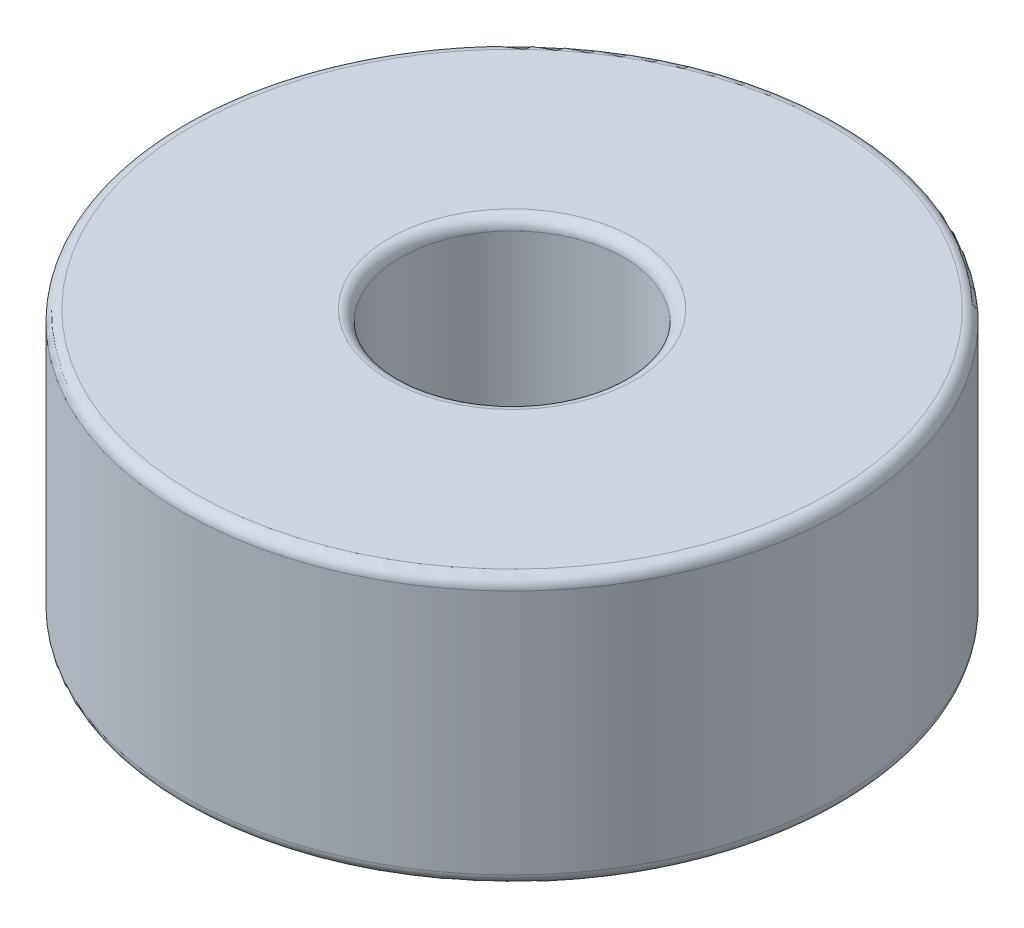
ISO-10303-21;
HEADER;
FILE_DESCRIPTION(('STEP AP214'),'2;1');
FILE_NAME('part.step','',(''),(''),'','','');
FILE_SCHEMA(('AUTOMOTIVE_DESIGN { 1 0 10303 214 1 1 1 1 }'));
ENDSEC;
DATA;
#1=APPLICATION_CONTEXT('core data for automotive mechanical design processes');
#2=APPLICATION_PROTOCOL_DEFINITION('international standard','automotive_design',2000,#1);
#3=PRODUCT_CONTEXT('',#1,'mechanical');
#4=PRODUCT('Part','Part','',(#3));
#5=PRODUCT_RELATED_PRODUCT_CATEGORY('part','',(#4));
#6=PRODUCT_DEFINITION_FORMATION('','',#4);
#7=PRODUCT_DEFINITION_CONTEXT('part definition',#1,'design');
#8=PRODUCT_DEFINITION('design','',#6,#7);
#9=PRODUCT_DEFINITION_SHAPE('','',#8);
#10=(LENGTH_UNIT() NAMED_UNIT(*) SI_UNIT(.MILLI.,.METRE.));
#11=(NAMED_UNIT(*) PLANE_ANGLE_UNIT() SI_UNIT($,.RADIAN.));
#12=(NAMED_UNIT(*) SI_UNIT($,.STERADIAN.) SOLID_ANGLE_UNIT());
#13=UNCERTAINTY_MEASURE_WITH_UNIT(LENGTH_MEASURE(1.E-05),#10,'distance_accuracy_value','');
#14=(GEOMETRIC_REPRESENTATION_CONTEXT(3) GLOBAL_UNCERTAINTY_ASSIGNED_CONTEXT((#13)) GLOBAL_UNIT_ASSIGNED_CONTEXT((#10,
#11,#12)) REPRESENTATION_CONTEXT('',''));
#15=CARTESIAN_POINT('',(0.,0.,0.));
#16=DIRECTION('',(0.,0.,1.));
#17=DIRECTION('',(1.,0.,0.));
#18=AXIS2_PLACEMENT_3D('',#15,#16,#17);
#19=CARTESIAN_POINT('',(0.,2.4,0.));
#20=DIRECTION('',(0.,-1.,0.));
#21=DIRECTION('',(0.,0.,-1.));
#22=AXIS2_PLACEMENT_3D('',#19,#20,#21);
#23=CYLINDRICAL_SURFACE('',#22,2.95);
#24=CARTESIAN_POINT('',(0.,0.0999999999999998,0.));
#25=DIRECTION('',(0.,1.,0.));
#26=DIRECTION('',(0.,0.,1.));
#27=AXIS2_PLACEMENT_3D('',#24,#25,#26);
#28=CIRCLE('',#27,2.95);
#29=CARTESIAN_POINT('',(0.,0.0999999999999998,2.95));
#30=VERTEX_POINT('',#29);
#31=EDGE_CURVE('E10',#30,#30,#28,.T.);
#32=ORIENTED_EDGE('',*,*,#31,.T.);
#33=EDGE_LOOP('',(#32));
#34=FACE_BOUND('',#33,.T.);
#35=CARTESIAN_POINT('',(0.,2.3,0.));
#36=DIRECTION('',(0.,1.,0.));
#37=DIRECTION('',(0.,0.,1.));
#38=AXIS2_PLACEMENT_3D('',#35,#36,#37);
#39=CIRCLE('',#38,2.95);
#40=CARTESIAN_POINT('',(0.,2.3,2.95));
#41=VERTEX_POINT('',#40);
#42=EDGE_CURVE('E37',#41,#41,#39,.F.);
#43=ORIENTED_EDGE('',*,*,#42,.T.);
#44=EDGE_LOOP('',(#43));
#45=FACE_BOUND('',#44,.T.);
#46=ADVANCED_FACE('F30',(#34,#45),#23,.T.);
#47=CARTESIAN_POINT('',(0.,2.4,0.));
#48=DIRECTION('',(0.,1.,0.));
#49=DIRECTION('',(0.,0.,1.));
#50=AXIS2_PLACEMENT_3D('',#47,#48,#49);
#51=PLANE('',#50);
#52=CARTESIAN_POINT('',(0.,2.4,0.));
#53=DIRECTION('',(0.,1.,0.));
#54=DIRECTION('',(0.,0.,1.));
#55=AXIS2_PLACEMENT_3D('',#52,#53,#54);
#56=CIRCLE('',#55,1.1);
#57=CARTESIAN_POINT('',(0.,2.4,1.1));
#58=VERTEX_POINT('',#57);
#59=EDGE_CURVE('E50',#58,#58,#56,.F.);
#60=ORIENTED_EDGE('',*,*,#59,.T.);
#61=EDGE_LOOP('',(#60));
#62=FACE_BOUND('',#61,.T.);
#63=CARTESIAN_POINT('',(0.,2.4,0.));
#64=DIRECTION('',(0.,1.,0.));
#65=DIRECTION('',(0.,0.,1.));
#66=AXIS2_PLACEMENT_3D('',#63,#64,#65);
#67=CIRCLE('',#66,2.85);
#68=CARTESIAN_POINT('',(0.,2.4,2.85));
#69=VERTEX_POINT('',#68);
#70=EDGE_CURVE('E53',#69,#69,#67,.T.);
#71=ORIENTED_EDGE('',*,*,#70,.T.);
#72=EDGE_LOOP('',(#71));
#73=FACE_BOUND('',#72,.T.);
#74=ADVANCED_FACE('F76',(#62,#73),#51,.T.);
#75=CARTESIAN_POINT('',(0.,0.,0.));
#76=DIRECTION('',(0.,1.,0.));
#77=DIRECTION('',(0.,0.,1.));
#78=AXIS2_PLACEMENT_3D('',#75,#76,#77);
#79=PLANE('',#78);
#80=CARTESIAN_POINT('',(0.,0.,0.));
#81=DIRECTION('',(0.,1.,0.));
#82=DIRECTION('',(0.,0.,1.));
#83=AXIS2_PLACEMENT_3D('',#80,#81,#82);
#84=CIRCLE('',#83,1.1);
#85=CARTESIAN_POINT('',(0.,0.,1.1));
#86=VERTEX_POINT('',#85);
#87=EDGE_CURVE('E41',#86,#86,#84,.T.);
#88=ORIENTED_EDGE('',*,*,#87,.T.);
#89=EDGE_LOOP('',(#88));
#90=FACE_BOUND('',#89,.T.);
#91=CARTESIAN_POINT('',(0.,0.,0.));
#92=DIRECTION('',(0.,1.,0.));
#93=DIRECTION('',(0.,0.,1.));
#94=AXIS2_PLACEMENT_3D('',#91,#92,#93);
#95=CIRCLE('',#94,2.85);
#96=CARTESIAN_POINT('',(0.,0.,2.85));
#97=VERTEX_POINT('',#96);
#98=EDGE_CURVE('E45',#97,#97,#95,.F.);
#99=ORIENTED_EDGE('',*,*,#98,.T.);
#100=EDGE_LOOP('',(#99));
#101=FACE_BOUND('',#100,.T.);
#102=ADVANCED_FACE('F73',(#90,#101),#79,.F.);
#103=CARTESIAN_POINT('',(0.,0.,0.));
#104=DIRECTION('',(0.,1.,0.));
#105=DIRECTION('',(0.,0.,1.));
#106=AXIS2_PLACEMENT_3D('',#103,#104,#105);
#107=CYLINDRICAL_SURFACE('',#106,1.);
#108=CARTESIAN_POINT('',(0.,2.3,0.));
#109=DIRECTION('',(0.,1.,0.));
#110=DIRECTION('',(0.,0.,1.));
#111=AXIS2_PLACEMENT_3D('',#108,#109,#110);
#112=CIRCLE('',#111,1.);
#113=CARTESIAN_POINT('',(0.,2.3,1.));
#114=VERTEX_POINT('',#113);
#115=EDGE_CURVE('E56',#114,#114,#112,.T.);
#116=ORIENTED_EDGE('',*,*,#115,.T.);
#117=EDGE_LOOP('',(#116));
#118=FACE_BOUND('',#117,.T.);
#119=CARTESIAN_POINT('',(0.,0.1,0.));
#120=DIRECTION('',(0.,1.,0.));
#121=DIRECTION('',(0.,0.,1.));
#122=AXIS2_PLACEMENT_3D('',#119,#120,#121);
#123=CIRCLE('',#122,1.);
#124=CARTESIAN_POINT('',(0.,0.1,1.));
#125=VERTEX_POINT('',#124);
#126=EDGE_CURVE('E59',#125,#125,#123,.F.);
#127=ORIENTED_EDGE('',*,*,#126,.T.);
#128=EDGE_LOOP('',(#127));
#129=FACE_BOUND('',#128,.T.);
#130=ADVANCED_FACE('F63',(#118,#129),#107,.F.);
#131=CARTESIAN_POINT('',(0.,2.3,0.));
#132=DIRECTION('',(0.,1.,0.));
#133=DIRECTION('',(0.,0.,1.));
#134=AXIS2_PLACEMENT_3D('',#131,#132,#133);
#135=TOROIDAL_SURFACE('',#134,1.1,0.1);
#136=ORIENTED_EDGE('',*,*,#59,.F.);
#137=EDGE_LOOP('',(#136));
#138=FACE_BOUND('',#137,.T.);
#139=ORIENTED_EDGE('',*,*,#115,.F.);
#140=EDGE_LOOP('',(#139));
#141=FACE_BOUND('',#140,.T.);
#142=ADVANCED_FACE('F69',(#138,#141),#135,.T.);
#143=CARTESIAN_POINT('',(0.,0.1,0.));
#144=DIRECTION('',(0.,1.,0.));
#145=DIRECTION('',(0.,0.,1.));
#146=AXIS2_PLACEMENT_3D('',#143,#144,#145);
#147=TOROIDAL_SURFACE('',#146,1.1,0.1);
#148=ORIENTED_EDGE('',*,*,#126,.F.);
#149=EDGE_LOOP('',(#148));
#150=FACE_BOUND('',#149,.T.);
#151=ORIENTED_EDGE('',*,*,#87,.F.);
#152=EDGE_LOOP('',(#151));
#153=FACE_BOUND('',#152,.T.);
#154=ADVANCED_FACE('F65',(#150,#153),#147,.T.);
#155=CARTESIAN_POINT('',(0.,0.0999999999999998,0.));
#156=DIRECTION('',(0.,1.,0.));
#157=DIRECTION('',(0.,0.,1.));
#158=AXIS2_PLACEMENT_3D('',#155,#156,#157);
#159=TOROIDAL_SURFACE('',#158,2.85,0.1);
#160=ORIENTED_EDGE('',*,*,#98,.F.);
#161=EDGE_LOOP('',(#160));
#162=FACE_BOUND('',#161,.T.);
#163=ORIENTED_EDGE('',*,*,#31,.F.);
#164=EDGE_LOOP('',(#163));
#165=FACE_BOUND('',#164,.T.);
#166=ADVANCED_FACE('F68',(#162,#165),#159,.T.);
#167=CARTESIAN_POINT('',(0.,2.3,0.));
#168=DIRECTION('',(0.,1.,0.));
#169=DIRECTION('',(0.,0.,1.));
#170=AXIS2_PLACEMENT_3D('',#167,#168,#169);
#171=TOROIDAL_SURFACE('',#170,2.85,0.1);
#172=ORIENTED_EDGE('',*,*,#42,.F.);
#173=EDGE_LOOP('',(#172));
#174=FACE_BOUND('',#173,.T.);
#175=ORIENTED_EDGE('',*,*,#70,.F.);
#176=EDGE_LOOP('',(#175));
#177=FACE_BOUND('',#176,.T.);
#178=ADVANCED_FACE('F32',(#174,#177),#171,.T.);
#179=CLOSED_SHELL('',(#46,#74,#102,#130,#142,#154,#166,#178));
#180=MANIFOLD_SOLID_BREP('B2',#179);
#181=ADVANCED_BREP_SHAPE_REPRESENTATION('',(#18,#180),#14);
#182=SHAPE_DEFINITION_REPRESENTATION(#9,#181);
ENDSEC;
END-ISO-10303-21;
